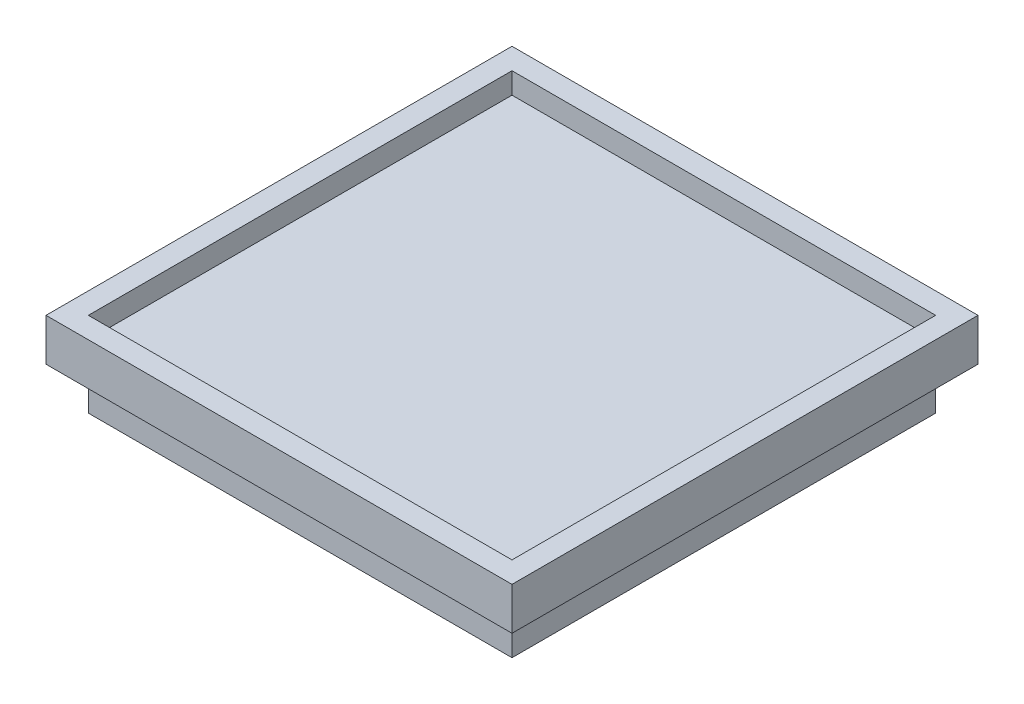
ISO-10303-21;
HEADER;
FILE_DESCRIPTION(('STEP AP214'),'2;1');
FILE_NAME('part.step','',(''),(''),'','','');
FILE_SCHEMA(('AUTOMOTIVE_DESIGN { 1 0 10303 214 1 1 1 1 }'));
ENDSEC;
DATA;
#1=APPLICATION_CONTEXT('core data for automotive mechanical design processes');
#2=APPLICATION_PROTOCOL_DEFINITION('international standard','automotive_design',2000,#1);
#3=PRODUCT_CONTEXT('',#1,'mechanical');
#4=PRODUCT('Part','Part','',(#3));
#5=PRODUCT_RELATED_PRODUCT_CATEGORY('part','',(#4));
#6=PRODUCT_DEFINITION_FORMATION('','',#4);
#7=PRODUCT_DEFINITION_CONTEXT('part definition',#1,'design');
#8=PRODUCT_DEFINITION('design','',#6,#7);
#9=PRODUCT_DEFINITION_SHAPE('','',#8);
#10=(LENGTH_UNIT() NAMED_UNIT(*) SI_UNIT(.MILLI.,.METRE.));
#11=(NAMED_UNIT(*) PLANE_ANGLE_UNIT() SI_UNIT($,.RADIAN.));
#12=(NAMED_UNIT(*) SI_UNIT($,.STERADIAN.) SOLID_ANGLE_UNIT());
#13=UNCERTAINTY_MEASURE_WITH_UNIT(LENGTH_MEASURE(1.E-05),#10,'distance_accuracy_value','');
#14=(GEOMETRIC_REPRESENTATION_CONTEXT(3) GLOBAL_UNCERTAINTY_ASSIGNED_CONTEXT((#13)) GLOBAL_UNIT_ASSIGNED_CONTEXT((#10,
#11,#12)) REPRESENTATION_CONTEXT('',''));
#15=CARTESIAN_POINT('',(0.,0.,0.));
#16=DIRECTION('',(0.,0.,1.));
#17=DIRECTION('',(1.,0.,0.));
#18=AXIS2_PLACEMENT_3D('',#15,#16,#17);
#19=CARTESIAN_POINT('',(0.,0.,0.));
#20=DIRECTION('',(0.,-1.,0.));
#21=DIRECTION('',(0.,0.,-1.));
#22=AXIS2_PLACEMENT_3D('',#19,#20,#21);
#23=PLANE('',#22);
#24=DIRECTION('',(0.,0.,-1.));
#25=VECTOR('',#24,1.);
#26=CARTESIAN_POINT('',(69.85,0.,69.85));
#27=LINE('',#26,#25);
#28=CARTESIAN_POINT('',(69.85,0.,69.85));
#29=VERTEX_POINT('',#28);
#30=CARTESIAN_POINT('',(69.85,0.,-69.85));
#31=VERTEX_POINT('',#30);
#32=EDGE_CURVE('E306',#29,#31,#27,.T.);
#33=ORIENTED_EDGE('',*,*,#32,.F.);
#34=DIRECTION('',(1.,0.,0.));
#35=VECTOR('',#34,1.);
#36=CARTESIAN_POINT('',(-69.85,0.,69.85));
#37=LINE('',#36,#35);
#38=CARTESIAN_POINT('',(-69.85,0.,69.85));
#39=VERTEX_POINT('',#38);
#40=EDGE_CURVE('E316',#39,#29,#37,.T.);
#41=ORIENTED_EDGE('',*,*,#40,.F.);
#42=DIRECTION('',(0.,0.,1.));
#43=VECTOR('',#42,1.);
#44=CARTESIAN_POINT('',(-69.85,0.,69.85));
#45=LINE('',#44,#43);
#46=CARTESIAN_POINT('',(-69.85,0.,-69.85));
#47=VERTEX_POINT('',#46);
#48=EDGE_CURVE('E313',#47,#39,#45,.T.);
#49=ORIENTED_EDGE('',*,*,#48,.F.);
#50=DIRECTION('',(-1.,0.,0.));
#51=VECTOR('',#50,1.);
#52=CARTESIAN_POINT('',(-69.85,0.,-69.85));
#53=LINE('',#52,#51);
#54=EDGE_CURVE('E310',#31,#47,#53,.T.);
#55=ORIENTED_EDGE('',*,*,#54,.F.);
#56=EDGE_LOOP('',(#33,#41,#49,#55));
#57=FACE_BOUND('',#56,.T.);
#58=DIRECTION('',(1.,0.,0.));
#59=VECTOR('',#58,1.);
#60=CARTESIAN_POINT('',(-63.5,0.,-63.5));
#61=LINE('',#60,#59);
#62=CARTESIAN_POINT('',(-63.5,0.,-63.5));
#63=VERTEX_POINT('',#62);
#64=CARTESIAN_POINT('',(63.5,0.,-63.5));
#65=VERTEX_POINT('',#64);
#66=EDGE_CURVE('E209',#63,#65,#61,.T.);
#67=ORIENTED_EDGE('',*,*,#66,.F.);
#68=DIRECTION('',(0.,0.,1.));
#69=VECTOR('',#68,1.);
#70=CARTESIAN_POINT('',(-63.5,0.,-63.5));
#71=LINE('',#70,#69);
#72=CARTESIAN_POINT('',(-63.5,0.,63.5));
#73=VERTEX_POINT('',#72);
#74=EDGE_CURVE('E63',#63,#73,#71,.T.);
#75=ORIENTED_EDGE('',*,*,#74,.T.);
#76=DIRECTION('',(1.,0.,0.));
#77=VECTOR('',#76,1.);
#78=CARTESIAN_POINT('',(-63.5,0.,63.5));
#79=LINE('',#78,#77);
#80=CARTESIAN_POINT('',(63.5,0.,63.5));
#81=VERTEX_POINT('',#80);
#82=EDGE_CURVE('E222',#73,#81,#79,.T.);
#83=ORIENTED_EDGE('',*,*,#82,.T.);
#84=DIRECTION('',(0.,0.,1.));
#85=VECTOR('',#84,1.);
#86=CARTESIAN_POINT('',(63.5,0.,-63.5));
#87=LINE('',#86,#85);
#88=EDGE_CURVE('E225',#65,#81,#87,.T.);
#89=ORIENTED_EDGE('',*,*,#88,.F.);
#90=EDGE_LOOP('',(#67,#75,#83,#89));
#91=FACE_BOUND('',#90,.T.);
#92=ADVANCED_FACE('F39',(#57,#91),#23,.T.);
#93=CARTESIAN_POINT('',(0.,12.7,0.));
#94=DIRECTION('',(0.,-1.,0.));
#95=DIRECTION('',(0.,0.,-1.));
#96=AXIS2_PLACEMENT_3D('',#93,#94,#95);
#97=PLANE('',#96);
#98=DIRECTION('',(0.,0.,-1.));
#99=VECTOR('',#98,1.);
#100=CARTESIAN_POINT('',(69.85,12.7,69.85));
#101=LINE('',#100,#99);
#102=CARTESIAN_POINT('',(69.85,12.7,69.85));
#103=VERTEX_POINT('',#102);
#104=CARTESIAN_POINT('',(69.85,12.7,-69.85));
#105=VERTEX_POINT('',#104);
#106=EDGE_CURVE('E257',#103,#105,#101,.T.);
#107=ORIENTED_EDGE('',*,*,#106,.T.);
#108=DIRECTION('',(-1.,0.,0.));
#109=VECTOR('',#108,1.);
#110=CARTESIAN_POINT('',(-69.85,12.7,-69.85));
#111=LINE('',#110,#109);
#112=CARTESIAN_POINT('',(-69.85,12.7,-69.85));
#113=VERTEX_POINT('',#112);
#114=EDGE_CURVE('E294',#105,#113,#111,.T.);
#115=ORIENTED_EDGE('',*,*,#114,.T.);
#116=DIRECTION('',(0.,0.,1.));
#117=VECTOR('',#116,1.);
#118=CARTESIAN_POINT('',(-69.85,12.7,69.85));
#119=LINE('',#118,#117);
#120=CARTESIAN_POINT('',(-69.85,12.7,69.85));
#121=VERTEX_POINT('',#120);
#122=EDGE_CURVE('E298',#113,#121,#119,.T.);
#123=ORIENTED_EDGE('',*,*,#122,.T.);
#124=DIRECTION('',(1.,0.,0.));
#125=VECTOR('',#124,1.);
#126=CARTESIAN_POINT('',(-69.85,12.7,69.85));
#127=LINE('',#126,#125);
#128=EDGE_CURVE('E302',#121,#103,#127,.T.);
#129=ORIENTED_EDGE('',*,*,#128,.T.);
#130=EDGE_LOOP('',(#107,#115,#123,#129));
#131=FACE_BOUND('',#130,.T.);
#132=DIRECTION('',(0.,0.,-1.));
#133=VECTOR('',#132,1.);
#134=CARTESIAN_POINT('',(63.5,12.7,0.));
#135=LINE('',#134,#133);
#136=CARTESIAN_POINT('',(63.5,12.7,63.5));
#137=VERTEX_POINT('',#136);
#138=CARTESIAN_POINT('',(63.5,12.7,-63.5));
#139=VERTEX_POINT('',#138);
#140=EDGE_CURVE('E236',#137,#139,#135,.T.);
#141=ORIENTED_EDGE('',*,*,#140,.F.);
#142=DIRECTION('',(1.,0.,0.));
#143=VECTOR('',#142,1.);
#144=CARTESIAN_POINT('',(0.,12.7,63.5));
#145=LINE('',#144,#143);
#146=CARTESIAN_POINT('',(-63.5,12.7,63.5));
#147=VERTEX_POINT('',#146);
#148=EDGE_CURVE('E252',#147,#137,#145,.T.);
#149=ORIENTED_EDGE('',*,*,#148,.F.);
#150=DIRECTION('',(0.,0.,1.));
#151=VECTOR('',#150,1.);
#152=CARTESIAN_POINT('',(-63.5,12.7,0.));
#153=LINE('',#152,#151);
#154=CARTESIAN_POINT('',(-63.5,12.7,-63.5));
#155=VERTEX_POINT('',#154);
#156=EDGE_CURVE('E285',#155,#147,#153,.T.);
#157=ORIENTED_EDGE('',*,*,#156,.F.);
#158=DIRECTION('',(-1.,0.,0.));
#159=VECTOR('',#158,1.);
#160=CARTESIAN_POINT('',(0.,12.7,-63.5));
#161=LINE('',#160,#159);
#162=EDGE_CURVE('E281',#139,#155,#161,.T.);
#163=ORIENTED_EDGE('',*,*,#162,.F.);
#164=EDGE_LOOP('',(#141,#149,#157,#163));
#165=FACE_BOUND('',#164,.T.);
#166=ADVANCED_FACE('F343',(#131,#165),#97,.F.);
#167=CARTESIAN_POINT('',(69.85,6.35,69.85));
#168=DIRECTION('',(-1.,0.,0.));
#169=DIRECTION('',(0.,0.,1.));
#170=AXIS2_PLACEMENT_3D('',#167,#168,#169);
#171=PLANE('',#170);
#172=ORIENTED_EDGE('',*,*,#32,.T.);
#173=DIRECTION('',(0.,-1.,0.));
#174=VECTOR('',#173,1.);
#175=CARTESIAN_POINT('',(69.85,6.35,-69.85));
#176=LINE('',#175,#174);
#177=EDGE_CURVE('E11',#105,#31,#176,.T.);
#178=ORIENTED_EDGE('',*,*,#177,.F.);
#179=ORIENTED_EDGE('',*,*,#106,.F.);
#180=DIRECTION('',(0.,-1.,0.));
#181=VECTOR('',#180,1.);
#182=CARTESIAN_POINT('',(69.85,6.35,69.85));
#183=LINE('',#182,#181);
#184=EDGE_CURVE('E319',#103,#29,#183,.T.);
#185=ORIENTED_EDGE('',*,*,#184,.T.);
#186=EDGE_LOOP('',(#172,#178,#179,#185));
#187=FACE_BOUND('',#186,.T.);
#188=ADVANCED_FACE('F41',(#187),#171,.F.);
#189=CARTESIAN_POINT('',(-69.85,6.35,-69.85));
#190=DIRECTION('',(0.,0.,1.));
#191=DIRECTION('',(1.,0.,0.));
#192=AXIS2_PLACEMENT_3D('',#189,#190,#191);
#193=PLANE('',#192);
#194=ORIENTED_EDGE('',*,*,#54,.T.);
#195=DIRECTION('',(0.,-1.,0.));
#196=VECTOR('',#195,1.);
#197=CARTESIAN_POINT('',(-69.85,6.35,-69.85));
#198=LINE('',#197,#196);
#199=EDGE_CURVE('E48',#113,#47,#198,.T.);
#200=ORIENTED_EDGE('',*,*,#199,.F.);
#201=ORIENTED_EDGE('',*,*,#114,.F.);
#202=ORIENTED_EDGE('',*,*,#177,.T.);
#203=EDGE_LOOP('',(#194,#200,#201,#202));
#204=FACE_BOUND('',#203,.T.);
#205=ADVANCED_FACE('F345',(#204),#193,.F.);
#206=CARTESIAN_POINT('',(-69.85,6.35,69.85));
#207=DIRECTION('',(1.,0.,0.));
#208=DIRECTION('',(0.,0.,-1.));
#209=AXIS2_PLACEMENT_3D('',#206,#207,#208);
#210=PLANE('',#209);
#211=ORIENTED_EDGE('',*,*,#48,.T.);
#212=DIRECTION('',(0.,-1.,0.));
#213=VECTOR('',#212,1.);
#214=CARTESIAN_POINT('',(-69.85,6.35,69.85));
#215=LINE('',#214,#213);
#216=EDGE_CURVE('E323',#121,#39,#215,.T.);
#217=ORIENTED_EDGE('',*,*,#216,.F.);
#218=ORIENTED_EDGE('',*,*,#122,.F.);
#219=ORIENTED_EDGE('',*,*,#199,.T.);
#220=EDGE_LOOP('',(#211,#217,#218,#219));
#221=FACE_BOUND('',#220,.T.);
#222=ADVANCED_FACE('F331',(#221),#210,.F.);
#223=CARTESIAN_POINT('',(-69.85,6.35,69.85));
#224=DIRECTION('',(0.,0.,-1.));
#225=DIRECTION('',(-1.,0.,0.));
#226=AXIS2_PLACEMENT_3D('',#223,#224,#225);
#227=PLANE('',#226);
#228=ORIENTED_EDGE('',*,*,#40,.T.);
#229=ORIENTED_EDGE('',*,*,#184,.F.);
#230=ORIENTED_EDGE('',*,*,#128,.F.);
#231=ORIENTED_EDGE('',*,*,#216,.T.);
#232=EDGE_LOOP('',(#228,#229,#230,#231));
#233=FACE_BOUND('',#232,.T.);
#234=ADVANCED_FACE('F338',(#233),#227,.F.);
#235=CARTESIAN_POINT('',(63.5,6.35,69.85));
#236=DIRECTION('',(-1.,0.,0.));
#237=DIRECTION('',(0.,0.,1.));
#238=AXIS2_PLACEMENT_3D('',#235,#236,#237);
#239=PLANE('',#238);
#240=DIRECTION('',(0.,0.,-1.));
#241=VECTOR('',#240,1.);
#242=CARTESIAN_POINT('',(63.5,6.35,0.));
#243=LINE('',#242,#241);
#244=CARTESIAN_POINT('',(63.5,6.35,63.5));
#245=VERTEX_POINT('',#244);
#246=CARTESIAN_POINT('',(63.5,6.35,-63.5));
#247=VERTEX_POINT('',#246);
#248=EDGE_CURVE('E247',#245,#247,#243,.T.);
#249=ORIENTED_EDGE('',*,*,#248,.F.);
#250=DIRECTION('',(0.,-1.,0.));
#251=VECTOR('',#250,1.);
#252=CARTESIAN_POINT('',(63.5,6.35,63.5));
#253=LINE('',#252,#251);
#254=EDGE_CURVE('E259',#137,#245,#253,.T.);
#255=ORIENTED_EDGE('',*,*,#254,.F.);
#256=ORIENTED_EDGE('',*,*,#140,.T.);
#257=DIRECTION('',(0.,-1.,0.));
#258=VECTOR('',#257,1.);
#259=CARTESIAN_POINT('',(63.5,6.35,-63.5));
#260=LINE('',#259,#258);
#261=EDGE_CURVE('E253',#139,#247,#260,.T.);
#262=ORIENTED_EDGE('',*,*,#261,.T.);
#263=EDGE_LOOP('',(#249,#255,#256,#262));
#264=FACE_BOUND('',#263,.T.);
#265=ADVANCED_FACE('F361',(#264),#239,.T.);
#266=CARTESIAN_POINT('',(-69.85,6.35,-63.5));
#267=DIRECTION('',(0.,0.,1.));
#268=DIRECTION('',(1.,0.,0.));
#269=AXIS2_PLACEMENT_3D('',#266,#267,#268);
#270=PLANE('',#269);
#271=DIRECTION('',(-1.,0.,0.));
#272=VECTOR('',#271,1.);
#273=CARTESIAN_POINT('',(0.,6.35,-63.5));
#274=LINE('',#273,#272);
#275=CARTESIAN_POINT('',(-63.5,6.35,-63.5));
#276=VERTEX_POINT('',#275);
#277=EDGE_CURVE('E251',#247,#276,#274,.T.);
#278=ORIENTED_EDGE('',*,*,#277,.F.);
#279=ORIENTED_EDGE('',*,*,#261,.F.);
#280=ORIENTED_EDGE('',*,*,#162,.T.);
#281=DIRECTION('',(0.,-1.,0.));
#282=VECTOR('',#281,1.);
#283=CARTESIAN_POINT('',(-63.5,6.35,-63.5));
#284=LINE('',#283,#282);
#285=EDGE_CURVE('E258',#155,#276,#284,.T.);
#286=ORIENTED_EDGE('',*,*,#285,.T.);
#287=EDGE_LOOP('',(#278,#279,#280,#286));
#288=FACE_BOUND('',#287,.T.);
#289=ADVANCED_FACE('F365',(#288),#270,.T.);
#290=CARTESIAN_POINT('',(-63.5,6.35,69.85));
#291=DIRECTION('',(1.,0.,0.));
#292=DIRECTION('',(0.,0.,-1.));
#293=AXIS2_PLACEMENT_3D('',#290,#291,#292);
#294=PLANE('',#293);
#295=DIRECTION('',(0.,0.,1.));
#296=VECTOR('',#295,1.);
#297=CARTESIAN_POINT('',(-63.5,6.35,0.));
#298=LINE('',#297,#296);
#299=CARTESIAN_POINT('',(-63.5,6.35,63.5));
#300=VERTEX_POINT('',#299);
#301=EDGE_CURVE('E267',#276,#300,#298,.T.);
#302=ORIENTED_EDGE('',*,*,#301,.F.);
#303=ORIENTED_EDGE('',*,*,#285,.F.);
#304=ORIENTED_EDGE('',*,*,#156,.T.);
#305=DIRECTION('',(0.,-1.,0.));
#306=VECTOR('',#305,1.);
#307=CARTESIAN_POINT('',(-63.5,6.35,63.5));
#308=LINE('',#307,#306);
#309=EDGE_CURVE('E263',#147,#300,#308,.T.);
#310=ORIENTED_EDGE('',*,*,#309,.T.);
#311=EDGE_LOOP('',(#302,#303,#304,#310));
#312=FACE_BOUND('',#311,.T.);
#313=ADVANCED_FACE('F371',(#312),#294,.T.);
#314=CARTESIAN_POINT('',(-69.85,6.35,63.5));
#315=DIRECTION('',(0.,0.,-1.));
#316=DIRECTION('',(-1.,0.,0.));
#317=AXIS2_PLACEMENT_3D('',#314,#315,#316);
#318=PLANE('',#317);
#319=DIRECTION('',(1.,0.,0.));
#320=VECTOR('',#319,1.);
#321=CARTESIAN_POINT('',(0.,6.35,63.5));
#322=LINE('',#321,#320);
#323=EDGE_CURVE('E264',#300,#245,#322,.T.);
#324=ORIENTED_EDGE('',*,*,#323,.F.);
#325=ORIENTED_EDGE('',*,*,#309,.F.);
#326=ORIENTED_EDGE('',*,*,#148,.T.);
#327=ORIENTED_EDGE('',*,*,#254,.T.);
#328=EDGE_LOOP('',(#324,#325,#326,#327));
#329=FACE_BOUND('',#328,.T.);
#330=ADVANCED_FACE('F381',(#329),#318,.T.);
#331=CARTESIAN_POINT('',(0.,6.35,0.));
#332=DIRECTION('',(0.,-1.,0.));
#333=DIRECTION('',(0.,0.,-1.));
#334=AXIS2_PLACEMENT_3D('',#331,#332,#333);
#335=PLANE('',#334);
#336=ORIENTED_EDGE('',*,*,#248,.T.);
#337=ORIENTED_EDGE('',*,*,#277,.T.);
#338=ORIENTED_EDGE('',*,*,#301,.T.);
#339=ORIENTED_EDGE('',*,*,#323,.T.);
#340=EDGE_LOOP('',(#336,#337,#338,#339));
#341=FACE_BOUND('',#340,.T.);
#342=ADVANCED_FACE('F384',(#341),#335,.F.);
#343=CARTESIAN_POINT('',(-63.5,-12.7,-63.5));
#344=DIRECTION('',(-1.,0.,0.));
#345=DIRECTION('',(0.,0.,1.));
#346=AXIS2_PLACEMENT_3D('',#343,#344,#345);
#347=PLANE('',#346);
#348=ORIENTED_EDGE('',*,*,#74,.F.);
#349=DIRECTION('',(0.,1.,0.));
#350=VECTOR('',#349,1.);
#351=CARTESIAN_POINT('',(-63.5,-12.7,-63.5));
#352=LINE('',#351,#350);
#353=CARTESIAN_POINT('',(-63.5,-12.7,-63.5));
#354=VERTEX_POINT('',#353);
#355=EDGE_CURVE('E232',#354,#63,#352,.T.);
#356=ORIENTED_EDGE('',*,*,#355,.F.);
#357=DIRECTION('',(0.,0.,1.));
#358=VECTOR('',#357,1.);
#359=CARTESIAN_POINT('',(-63.5,-12.7,-63.5));
#360=LINE('',#359,#358);
#361=CARTESIAN_POINT('',(-63.5,-12.7,63.5));
#362=VERTEX_POINT('',#361);
#363=EDGE_CURVE('E204',#354,#362,#360,.T.);
#364=ORIENTED_EDGE('',*,*,#363,.T.);
#365=DIRECTION('',(0.,1.,0.));
#366=VECTOR('',#365,1.);
#367=CARTESIAN_POINT('',(-63.5,-12.7,63.5));
#368=LINE('',#367,#366);
#369=EDGE_CURVE('E219',#362,#73,#368,.T.);
#370=ORIENTED_EDGE('',*,*,#369,.T.);
#371=EDGE_LOOP('',(#348,#356,#364,#370));
#372=FACE_BOUND('',#371,.T.);
#373=ADVANCED_FACE('F376',(#372),#347,.T.);
#374=CARTESIAN_POINT('',(-63.5,-12.7,-63.5));
#375=DIRECTION('',(0.,0.,1.));
#376=DIRECTION('',(1.,0.,0.));
#377=AXIS2_PLACEMENT_3D('',#374,#375,#376);
#378=PLANE('',#377);
#379=ORIENTED_EDGE('',*,*,#66,.T.);
#380=DIRECTION('',(0.,1.,0.));
#381=VECTOR('',#380,1.);
#382=CARTESIAN_POINT('',(63.5,-12.7,-63.5));
#383=LINE('',#382,#381);
#384=CARTESIAN_POINT('',(63.5,-12.7,-63.5));
#385=VERTEX_POINT('',#384);
#386=EDGE_CURVE('E237',#385,#65,#383,.T.);
#387=ORIENTED_EDGE('',*,*,#386,.F.);
#388=DIRECTION('',(1.,0.,0.));
#389=VECTOR('',#388,1.);
#390=CARTESIAN_POINT('',(-63.5,-12.7,-63.5));
#391=LINE('',#390,#389);
#392=EDGE_CURVE('E216',#354,#385,#391,.T.);
#393=ORIENTED_EDGE('',*,*,#392,.F.);
#394=ORIENTED_EDGE('',*,*,#355,.T.);
#395=EDGE_LOOP('',(#379,#387,#393,#394));
#396=FACE_BOUND('',#395,.T.);
#397=ADVANCED_FACE('F391',(#396),#378,.F.);
#398=CARTESIAN_POINT('',(63.5,-12.7,-63.5));
#399=DIRECTION('',(-1.,0.,0.));
#400=DIRECTION('',(0.,0.,1.));
#401=AXIS2_PLACEMENT_3D('',#398,#399,#400);
#402=PLANE('',#401);
#403=ORIENTED_EDGE('',*,*,#88,.T.);
#404=DIRECTION('',(0.,1.,0.));
#405=VECTOR('',#404,1.);
#406=CARTESIAN_POINT('',(63.5,-12.7,63.5));
#407=LINE('',#406,#405);
#408=CARTESIAN_POINT('',(63.5,-12.7,63.5));
#409=VERTEX_POINT('',#408);
#410=EDGE_CURVE('E241',#409,#81,#407,.T.);
#411=ORIENTED_EDGE('',*,*,#410,.F.);
#412=DIRECTION('',(0.,0.,1.));
#413=VECTOR('',#412,1.);
#414=CARTESIAN_POINT('',(63.5,-12.7,-63.5));
#415=LINE('',#414,#413);
#416=EDGE_CURVE('E213',#385,#409,#415,.T.);
#417=ORIENTED_EDGE('',*,*,#416,.F.);
#418=ORIENTED_EDGE('',*,*,#386,.T.);
#419=EDGE_LOOP('',(#403,#411,#417,#418));
#420=FACE_BOUND('',#419,.T.);
#421=ADVANCED_FACE('F403',(#420),#402,.F.);
#422=CARTESIAN_POINT('',(-63.5,-12.7,63.5));
#423=DIRECTION('',(0.,0.,1.));
#424=DIRECTION('',(1.,0.,0.));
#425=AXIS2_PLACEMENT_3D('',#422,#423,#424);
#426=PLANE('',#425);
#427=ORIENTED_EDGE('',*,*,#82,.F.);
#428=ORIENTED_EDGE('',*,*,#369,.F.);
#429=DIRECTION('',(1.,0.,0.));
#430=VECTOR('',#429,1.);
#431=CARTESIAN_POINT('',(-63.5,-12.7,63.5));
#432=LINE('',#431,#430);
#433=EDGE_CURVE('E208',#362,#409,#432,.T.);
#434=ORIENTED_EDGE('',*,*,#433,.T.);
#435=ORIENTED_EDGE('',*,*,#410,.T.);
#436=EDGE_LOOP('',(#427,#428,#434,#435));
#437=FACE_BOUND('',#436,.T.);
#438=ADVANCED_FACE('F411',(#437),#426,.T.);
#439=CARTESIAN_POINT('',(0.,-12.7,0.));
#440=DIRECTION('',(0.,1.,0.));
#441=DIRECTION('',(0.,0.,1.));
#442=AXIS2_PLACEMENT_3D('',#439,#440,#441);
#443=PLANE('',#442);
#444=DIRECTION('',(1.,0.,0.));
#445=VECTOR('',#444,1.);
#446=CARTESIAN_POINT('',(0.,-12.7,-57.15));
#447=LINE('',#446,#445);
#448=CARTESIAN_POINT('',(-57.15,-12.7,-57.15));
#449=VERTEX_POINT('',#448);
#450=CARTESIAN_POINT('',(57.15,-12.7,-57.15));
#451=VERTEX_POINT('',#450);
#452=EDGE_CURVE('E160',#449,#451,#447,.T.);
#453=ORIENTED_EDGE('',*,*,#452,.F.);
#454=DIRECTION('',(0.,0.,1.));
#455=VECTOR('',#454,1.);
#456=CARTESIAN_POINT('',(-57.15,-12.7,0.));
#457=LINE('',#456,#455);
#458=CARTESIAN_POINT('',(-57.15,-12.7,57.15));
#459=VERTEX_POINT('',#458);
#460=EDGE_CURVE('E170',#449,#459,#457,.T.);
#461=ORIENTED_EDGE('',*,*,#460,.T.);
#462=DIRECTION('',(1.,0.,0.));
#463=VECTOR('',#462,1.);
#464=CARTESIAN_POINT('',(0.,-12.7,57.15));
#465=LINE('',#464,#463);
#466=CARTESIAN_POINT('',(57.15,-12.7,57.15));
#467=VERTEX_POINT('',#466);
#468=EDGE_CURVE('E177',#459,#467,#465,.T.);
#469=ORIENTED_EDGE('',*,*,#468,.T.);
#470=DIRECTION('',(0.,0.,1.));
#471=VECTOR('',#470,1.);
#472=CARTESIAN_POINT('',(57.15,-12.7,0.));
#473=LINE('',#472,#471);
#474=EDGE_CURVE('E182',#451,#467,#473,.T.);
#475=ORIENTED_EDGE('',*,*,#474,.F.);
#476=EDGE_LOOP('',(#453,#461,#469,#475));
#477=FACE_BOUND('',#476,.T.);
#478=ORIENTED_EDGE('',*,*,#363,.F.);
#479=ORIENTED_EDGE('',*,*,#392,.T.);
#480=ORIENTED_EDGE('',*,*,#416,.T.);
#481=ORIENTED_EDGE('',*,*,#433,.F.);
#482=EDGE_LOOP('',(#478,#479,#480,#481));
#483=FACE_BOUND('',#482,.T.);
#484=ADVANCED_FACE('F180',(#477,#483),#443,.F.);
#485=CARTESIAN_POINT('',(57.15,-12.7,-63.5));
#486=DIRECTION('',(-1.,0.,0.));
#487=DIRECTION('',(0.,0.,1.));
#488=AXIS2_PLACEMENT_3D('',#485,#486,#487);
#489=PLANE('',#488);
#490=DIRECTION('',(0.,1.,0.));
#491=VECTOR('',#490,1.);
#492=CARTESIAN_POINT('',(57.15,-12.7,-57.15));
#493=LINE('',#492,#491);
#494=CARTESIAN_POINT('',(57.15,0.,-57.15));
#495=VERTEX_POINT('',#494);
#496=EDGE_CURVE('E167',#451,#495,#493,.T.);
#497=ORIENTED_EDGE('',*,*,#496,.F.);
#498=ORIENTED_EDGE('',*,*,#474,.T.);
#499=DIRECTION('',(0.,1.,0.));
#500=VECTOR('',#499,1.);
#501=CARTESIAN_POINT('',(57.15,-12.7,57.15));
#502=LINE('',#501,#500);
#503=CARTESIAN_POINT('',(57.15,0.,57.15));
#504=VERTEX_POINT('',#503);
#505=EDGE_CURVE('E55',#467,#504,#502,.T.);
#506=ORIENTED_EDGE('',*,*,#505,.T.);
#507=DIRECTION('',(0.,0.,1.));
#508=VECTOR('',#507,1.);
#509=CARTESIAN_POINT('',(57.15,0.,-63.5));
#510=LINE('',#509,#508);
#511=EDGE_CURVE('E201',#495,#504,#510,.T.);
#512=ORIENTED_EDGE('',*,*,#511,.F.);
#513=EDGE_LOOP('',(#497,#498,#506,#512));
#514=FACE_BOUND('',#513,.T.);
#515=ADVANCED_FACE('F417',(#514),#489,.T.);
#516=CARTESIAN_POINT('',(-63.5,-12.7,57.15));
#517=DIRECTION('',(0.,0.,1.));
#518=DIRECTION('',(1.,0.,0.));
#519=AXIS2_PLACEMENT_3D('',#516,#517,#518);
#520=PLANE('',#519);
#521=DIRECTION('',(1.,0.,0.));
#522=VECTOR('',#521,1.);
#523=CARTESIAN_POINT('',(-63.5,0.,57.15));
#524=LINE('',#523,#522);
#525=CARTESIAN_POINT('',(-57.15,0.,57.15));
#526=VERTEX_POINT('',#525);
#527=EDGE_CURVE('E198',#526,#504,#524,.T.);
#528=ORIENTED_EDGE('',*,*,#527,.T.);
#529=ORIENTED_EDGE('',*,*,#505,.F.);
#530=ORIENTED_EDGE('',*,*,#468,.F.);
#531=DIRECTION('',(0.,1.,0.));
#532=VECTOR('',#531,1.);
#533=CARTESIAN_POINT('',(-57.15,-12.7,57.15));
#534=LINE('',#533,#532);
#535=EDGE_CURVE('E173',#459,#526,#534,.T.);
#536=ORIENTED_EDGE('',*,*,#535,.T.);
#537=EDGE_LOOP('',(#528,#529,#530,#536));
#538=FACE_BOUND('',#537,.T.);
#539=ADVANCED_FACE('F423',(#538),#520,.F.);
#540=CARTESIAN_POINT('',(-57.15,-12.7,-63.5));
#541=DIRECTION('',(-1.,0.,0.));
#542=DIRECTION('',(0.,0.,1.));
#543=AXIS2_PLACEMENT_3D('',#540,#541,#542);
#544=PLANE('',#543);
#545=DIRECTION('',(0.,0.,1.));
#546=VECTOR('',#545,1.);
#547=CARTESIAN_POINT('',(-57.15,0.,-63.5));
#548=LINE('',#547,#546);
#549=CARTESIAN_POINT('',(-57.15,0.,-57.15));
#550=VERTEX_POINT('',#549);
#551=EDGE_CURVE('E195',#550,#526,#548,.T.);
#552=ORIENTED_EDGE('',*,*,#551,.T.);
#553=ORIENTED_EDGE('',*,*,#535,.F.);
#554=ORIENTED_EDGE('',*,*,#460,.F.);
#555=DIRECTION('',(0.,1.,0.));
#556=VECTOR('',#555,1.);
#557=CARTESIAN_POINT('',(-57.15,-12.7,-57.15));
#558=LINE('',#557,#556);
#559=EDGE_CURVE('E155',#449,#550,#558,.T.);
#560=ORIENTED_EDGE('',*,*,#559,.T.);
#561=EDGE_LOOP('',(#552,#553,#554,#560));
#562=FACE_BOUND('',#561,.T.);
#563=ADVANCED_FACE('F171',(#562),#544,.F.);
#564=CARTESIAN_POINT('',(-63.5,-12.7,-57.15));
#565=DIRECTION('',(0.,0.,1.));
#566=DIRECTION('',(1.,0.,0.));
#567=AXIS2_PLACEMENT_3D('',#564,#565,#566);
#568=PLANE('',#567);
#569=ORIENTED_EDGE('',*,*,#559,.F.);
#570=ORIENTED_EDGE('',*,*,#452,.T.);
#571=ORIENTED_EDGE('',*,*,#496,.T.);
#572=DIRECTION('',(1.,0.,0.));
#573=VECTOR('',#572,1.);
#574=CARTESIAN_POINT('',(-63.5,0.,-57.15));
#575=LINE('',#574,#573);
#576=EDGE_CURVE('E163',#550,#495,#575,.T.);
#577=ORIENTED_EDGE('',*,*,#576,.F.);
#578=EDGE_LOOP('',(#569,#570,#571,#577));
#579=FACE_BOUND('',#578,.T.);
#580=ADVANCED_FACE('F157',(#579),#568,.T.);
#581=CARTESIAN_POINT('',(0.,0.,0.));
#582=DIRECTION('',(0.,-1.,0.));
#583=DIRECTION('',(0.,0.,-1.));
#584=AXIS2_PLACEMENT_3D('',#581,#582,#583);
#585=PLANE('',#584);
#586=ORIENTED_EDGE('',*,*,#511,.T.);
#587=ORIENTED_EDGE('',*,*,#527,.F.);
#588=ORIENTED_EDGE('',*,*,#551,.F.);
#589=ORIENTED_EDGE('',*,*,#576,.T.);
#590=EDGE_LOOP('',(#586,#587,#588,#589));
#591=FACE_BOUND('',#590,.T.);
#592=ADVANCED_FACE('F472',(#591),#585,.T.);
#593=CLOSED_SHELL('',(#92,#166,#188,#205,#222,#234,#265,#289,#313,#330,#342,#373,#397,#421,#438,
#484,#515,#539,#563,#580,#592));
#594=MANIFOLD_SOLID_BREP('B2',#593);
#595=ADVANCED_BREP_SHAPE_REPRESENTATION('',(#18,#594),#14);
#596=SHAPE_DEFINITION_REPRESENTATION(#9,#595);
ENDSEC;
END-ISO-10303-21;
